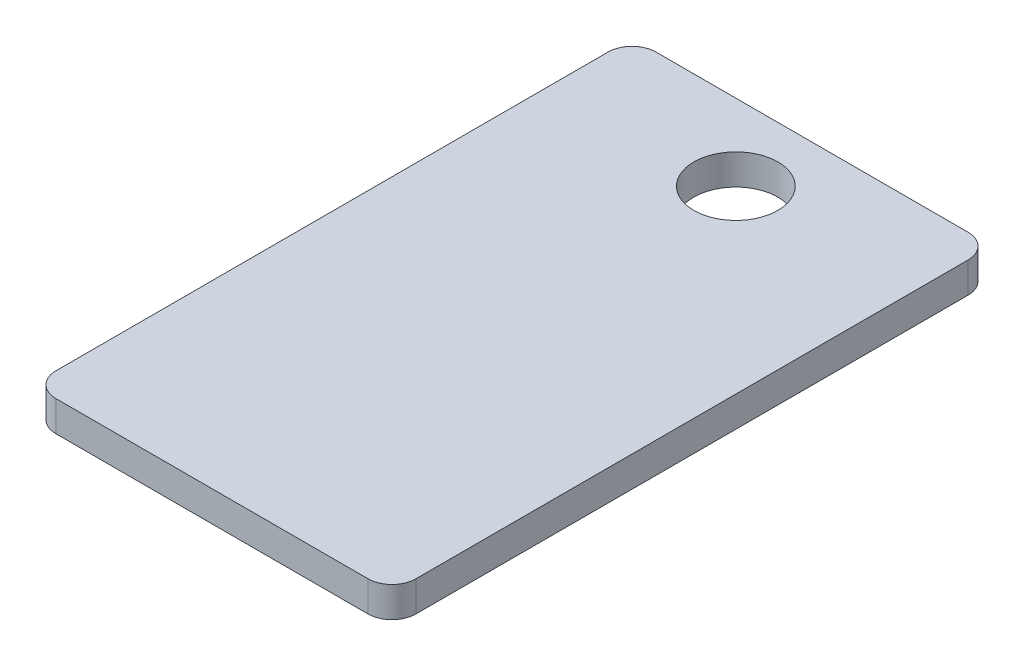
ISO-10303-21;
HEADER;
FILE_DESCRIPTION(('STEP AP214'),'2;1');
FILE_NAME('part.step','',(''),(''),'','','');
FILE_SCHEMA(('AUTOMOTIVE_DESIGN { 1 0 10303 214 1 1 1 1 }'));
ENDSEC;
DATA;
#1=APPLICATION_CONTEXT('core data for automotive mechanical design processes');
#2=APPLICATION_PROTOCOL_DEFINITION('international standard','automotive_design',2000,#1);
#3=PRODUCT_CONTEXT('',#1,'mechanical');
#4=PRODUCT('Part','Part','',(#3));
#5=PRODUCT_RELATED_PRODUCT_CATEGORY('part','',(#4));
#6=PRODUCT_DEFINITION_FORMATION('','',#4);
#7=PRODUCT_DEFINITION_CONTEXT('part definition',#1,'design');
#8=PRODUCT_DEFINITION('design','',#6,#7);
#9=PRODUCT_DEFINITION_SHAPE('','',#8);
#10=(LENGTH_UNIT() NAMED_UNIT(*) SI_UNIT(.MILLI.,.METRE.));
#11=(NAMED_UNIT(*) PLANE_ANGLE_UNIT() SI_UNIT($,.RADIAN.));
#12=(NAMED_UNIT(*) SI_UNIT($,.STERADIAN.) SOLID_ANGLE_UNIT());
#13=UNCERTAINTY_MEASURE_WITH_UNIT(LENGTH_MEASURE(1.E-05),#10,'distance_accuracy_value','');
#14=(GEOMETRIC_REPRESENTATION_CONTEXT(3) GLOBAL_UNCERTAINTY_ASSIGNED_CONTEXT((#13)) GLOBAL_UNIT_ASSIGNED_CONTEXT((#10,
#11,#12)) REPRESENTATION_CONTEXT('',''));
#15=CARTESIAN_POINT('',(0.,0.,0.));
#16=DIRECTION('',(0.,0.,1.));
#17=DIRECTION('',(1.,0.,0.));
#18=AXIS2_PLACEMENT_3D('',#15,#16,#17);
#19=CARTESIAN_POINT('',(0.,1.27,0.));
#20=DIRECTION('',(0.,1.,0.));
#21=DIRECTION('',(0.,0.,1.));
#22=AXIS2_PLACEMENT_3D('',#19,#20,#21);
#23=PLANE('',#22);
#24=DIRECTION('',(0.,0.,1.));
#25=VECTOR('',#24,1.);
#26=CARTESIAN_POINT('',(0.,1.27,0.));
#27=LINE('',#26,#25);
#28=CARTESIAN_POINT('',(0.,1.27,1.));
#29=VERTEX_POINT('',#28);
#30=CARTESIAN_POINT('',(0.,1.27,24.));
#31=VERTEX_POINT('',#30);
#32=EDGE_CURVE('E154',#29,#31,#27,.T.);
#33=ORIENTED_EDGE('',*,*,#32,.T.);
#34=CARTESIAN_POINT('',(1.,1.27,24.));
#35=DIRECTION('',(0.,1.,0.));
#36=DIRECTION('',(0.,0.,1.));
#37=AXIS2_PLACEMENT_3D('',#34,#35,#36);
#38=CIRCLE('',#37,1.);
#39=CARTESIAN_POINT('',(1.,1.27,25.));
#40=VERTEX_POINT('',#39);
#41=EDGE_CURVE('E178',#31,#40,#38,.T.);
#42=ORIENTED_EDGE('',*,*,#41,.T.);
#43=DIRECTION('',(1.,0.,0.));
#44=VECTOR('',#43,1.);
#45=CARTESIAN_POINT('',(0.,1.27,25.));
#46=LINE('',#45,#44);
#47=CARTESIAN_POINT('',(14.,1.27,25.));
#48=VERTEX_POINT('',#47);
#49=EDGE_CURVE('E131',#40,#48,#46,.T.);
#50=ORIENTED_EDGE('',*,*,#49,.T.);
#51=CARTESIAN_POINT('',(14.,1.27,24.));
#52=DIRECTION('',(0.,1.,0.));
#53=DIRECTION('',(0.,0.,1.));
#54=AXIS2_PLACEMENT_3D('',#51,#52,#53);
#55=CIRCLE('',#54,1.);
#56=CARTESIAN_POINT('',(15.,1.27,24.));
#57=VERTEX_POINT('',#56);
#58=EDGE_CURVE('E175',#48,#57,#55,.T.);
#59=ORIENTED_EDGE('',*,*,#58,.T.);
#60=DIRECTION('',(0.,0.,-1.));
#61=VECTOR('',#60,1.);
#62=CARTESIAN_POINT('',(15.,1.27,0.));
#63=LINE('',#62,#61);
#64=CARTESIAN_POINT('',(15.,1.27,1.));
#65=VERTEX_POINT('',#64);
#66=EDGE_CURVE('E190',#57,#65,#63,.T.);
#67=ORIENTED_EDGE('',*,*,#66,.T.);
#68=CARTESIAN_POINT('',(14.,1.27,1.));
#69=DIRECTION('',(0.,1.,0.));
#70=DIRECTION('',(0.,0.,1.));
#71=AXIS2_PLACEMENT_3D('',#68,#69,#70);
#72=CIRCLE('',#71,1.);
#73=CARTESIAN_POINT('',(14.,1.27,0.));
#74=VERTEX_POINT('',#73);
#75=EDGE_CURVE('E65',#65,#74,#72,.T.);
#76=ORIENTED_EDGE('',*,*,#75,.T.);
#77=DIRECTION('',(-1.,0.,0.));
#78=VECTOR('',#77,1.);
#79=CARTESIAN_POINT('',(0.,1.27,0.));
#80=LINE('',#79,#78);
#81=CARTESIAN_POINT('',(1.,1.27,0.));
#82=VERTEX_POINT('',#81);
#83=EDGE_CURVE('E156',#74,#82,#80,.T.);
#84=ORIENTED_EDGE('',*,*,#83,.T.);
#85=CARTESIAN_POINT('',(1.,1.27,1.));
#86=DIRECTION('',(0.,1.,0.));
#87=DIRECTION('',(0.,0.,1.));
#88=AXIS2_PLACEMENT_3D('',#85,#86,#87);
#89=CIRCLE('',#88,1.);
#90=EDGE_CURVE('E170',#82,#29,#89,.T.);
#91=ORIENTED_EDGE('',*,*,#90,.T.);
#92=EDGE_LOOP('',(#33,#42,#50,#59,#67,#76,#84,#91));
#93=FACE_BOUND('',#92,.T.);
#94=CARTESIAN_POINT('',(7.5,1.27,3.175));
#95=DIRECTION('',(0.,1.,0.));
#96=DIRECTION('',(0.,0.,1.));
#97=AXIS2_PLACEMENT_3D('',#94,#95,#96);
#98=CIRCLE('',#97,1.75);
#99=CARTESIAN_POINT('',(7.5,1.27,4.925));
#100=VERTEX_POINT('',#99);
#101=EDGE_CURVE('E148',#100,#100,#98,.T.);
#102=ORIENTED_EDGE('',*,*,#101,.F.);
#103=EDGE_LOOP('',(#102));
#104=FACE_BOUND('',#103,.T.);
#105=ADVANCED_FACE('F43',(#93,#104),#23,.T.);
#106=CARTESIAN_POINT('',(0.,0.,0.));
#107=DIRECTION('',(0.,1.,0.));
#108=DIRECTION('',(0.,0.,1.));
#109=AXIS2_PLACEMENT_3D('',#106,#107,#108);
#110=PLANE('',#109);
#111=DIRECTION('',(1.,0.,0.));
#112=VECTOR('',#111,1.);
#113=CARTESIAN_POINT('',(0.,0.,25.));
#114=LINE('',#113,#112);
#115=CARTESIAN_POINT('',(1.,0.,25.));
#116=VERTEX_POINT('',#115);
#117=CARTESIAN_POINT('',(14.,0.,25.));
#118=VERTEX_POINT('',#117);
#119=EDGE_CURVE('E128',#116,#118,#114,.T.);
#120=ORIENTED_EDGE('',*,*,#119,.F.);
#121=CARTESIAN_POINT('',(1.,0.,24.));
#122=DIRECTION('',(0.,1.,0.));
#123=DIRECTION('',(0.,0.,1.));
#124=AXIS2_PLACEMENT_3D('',#121,#122,#123);
#125=CIRCLE('',#124,1.);
#126=CARTESIAN_POINT('',(0.,0.,24.));
#127=VERTEX_POINT('',#126);
#128=EDGE_CURVE('E110',#116,#127,#125,.F.);
#129=ORIENTED_EDGE('',*,*,#128,.T.);
#130=DIRECTION('',(0.,0.,1.));
#131=VECTOR('',#130,1.);
#132=CARTESIAN_POINT('',(0.,0.,0.));
#133=LINE('',#132,#131);
#134=CARTESIAN_POINT('',(0.,0.,1.));
#135=VERTEX_POINT('',#134);
#136=EDGE_CURVE('E141',#135,#127,#133,.T.);
#137=ORIENTED_EDGE('',*,*,#136,.F.);
#138=CARTESIAN_POINT('',(1.,0.,1.));
#139=DIRECTION('',(0.,1.,0.));
#140=DIRECTION('',(0.,0.,1.));
#141=AXIS2_PLACEMENT_3D('',#138,#139,#140);
#142=CIRCLE('',#141,1.);
#143=CARTESIAN_POINT('',(1.,0.,0.));
#144=VERTEX_POINT('',#143);
#145=EDGE_CURVE('E133',#135,#144,#142,.F.);
#146=ORIENTED_EDGE('',*,*,#145,.T.);
#147=DIRECTION('',(-1.,0.,0.));
#148=VECTOR('',#147,1.);
#149=CARTESIAN_POINT('',(0.,0.,0.));
#150=LINE('',#149,#148);
#151=CARTESIAN_POINT('',(14.,0.,0.));
#152=VERTEX_POINT('',#151);
#153=EDGE_CURVE('E146',#152,#144,#150,.T.);
#154=ORIENTED_EDGE('',*,*,#153,.F.);
#155=CARTESIAN_POINT('',(14.,0.,1.));
#156=DIRECTION('',(0.,1.,0.));
#157=DIRECTION('',(0.,0.,1.));
#158=AXIS2_PLACEMENT_3D('',#155,#156,#157);
#159=CIRCLE('',#158,1.);
#160=CARTESIAN_POINT('',(15.,0.,1.));
#161=VERTEX_POINT('',#160);
#162=EDGE_CURVE('E160',#152,#161,#159,.F.);
#163=ORIENTED_EDGE('',*,*,#162,.T.);
#164=DIRECTION('',(0.,0.,-1.));
#165=VECTOR('',#164,1.);
#166=CARTESIAN_POINT('',(15.,0.,0.));
#167=LINE('',#166,#165);
#168=CARTESIAN_POINT('',(15.,0.,24.));
#169=VERTEX_POINT('',#168);
#170=EDGE_CURVE('E140',#169,#161,#167,.T.);
#171=ORIENTED_EDGE('',*,*,#170,.F.);
#172=CARTESIAN_POINT('',(14.,0.,24.));
#173=DIRECTION('',(0.,1.,0.));
#174=DIRECTION('',(0.,0.,1.));
#175=AXIS2_PLACEMENT_3D('',#172,#173,#174);
#176=CIRCLE('',#175,1.);
#177=EDGE_CURVE('E122',#169,#118,#176,.F.);
#178=ORIENTED_EDGE('',*,*,#177,.T.);
#179=EDGE_LOOP('',(#120,#129,#137,#146,#154,#163,#171,#178));
#180=FACE_BOUND('',#179,.T.);
#181=CARTESIAN_POINT('',(7.5,0.,3.175));
#182=DIRECTION('',(0.,1.,0.));
#183=DIRECTION('',(0.,0.,1.));
#184=AXIS2_PLACEMENT_3D('',#181,#182,#183);
#185=CIRCLE('',#184,1.75);
#186=CARTESIAN_POINT('',(7.5,0.,4.925));
#187=VERTEX_POINT('',#186);
#188=EDGE_CURVE('E199',#187,#187,#185,.T.);
#189=ORIENTED_EDGE('',*,*,#188,.T.);
#190=EDGE_LOOP('',(#189));
#191=FACE_BOUND('',#190,.T.);
#192=ADVANCED_FACE('F136',(#180,#191),#110,.F.);
#193=CARTESIAN_POINT('',(0.,1.27,0.));
#194=DIRECTION('',(1.,0.,0.));
#195=DIRECTION('',(0.,0.,-1.));
#196=AXIS2_PLACEMENT_3D('',#193,#194,#195);
#197=PLANE('',#196);
#198=ORIENTED_EDGE('',*,*,#136,.T.);
#199=DIRECTION('',(0.,-1.,0.));
#200=VECTOR('',#199,1.);
#201=CARTESIAN_POINT('',(0.,1.27,24.));
#202=LINE('',#201,#200);
#203=EDGE_CURVE('E115',#127,#31,#202,.F.);
#204=ORIENTED_EDGE('',*,*,#203,.T.);
#205=ORIENTED_EDGE('',*,*,#32,.F.);
#206=DIRECTION('',(0.,-1.,0.));
#207=VECTOR('',#206,1.);
#208=CARTESIAN_POINT('',(0.,1.27,1.));
#209=LINE('',#208,#207);
#210=EDGE_CURVE('E121',#29,#135,#209,.T.);
#211=ORIENTED_EDGE('',*,*,#210,.T.);
#212=EDGE_LOOP('',(#198,#204,#205,#211));
#213=FACE_BOUND('',#212,.T.);
#214=ADVANCED_FACE('F215',(#213),#197,.F.);
#215=CARTESIAN_POINT('',(0.,1.27,25.));
#216=DIRECTION('',(0.,0.,-1.));
#217=DIRECTION('',(-1.,0.,0.));
#218=AXIS2_PLACEMENT_3D('',#215,#216,#217);
#219=PLANE('',#218);
#220=ORIENTED_EDGE('',*,*,#49,.F.);
#221=DIRECTION('',(0.,-1.,0.));
#222=VECTOR('',#221,1.);
#223=CARTESIAN_POINT('',(1.,1.27,25.));
#224=LINE('',#223,#222);
#225=EDGE_CURVE('E114',#40,#116,#224,.T.);
#226=ORIENTED_EDGE('',*,*,#225,.T.);
#227=ORIENTED_EDGE('',*,*,#119,.T.);
#228=DIRECTION('',(0.,-1.,0.));
#229=VECTOR('',#228,1.);
#230=CARTESIAN_POINT('',(14.,1.27,25.));
#231=LINE('',#230,#229);
#232=EDGE_CURVE('E134',#118,#48,#231,.F.);
#233=ORIENTED_EDGE('',*,*,#232,.T.);
#234=EDGE_LOOP('',(#220,#226,#227,#233));
#235=FACE_BOUND('',#234,.T.);
#236=ADVANCED_FACE('F127',(#235),#219,.F.);
#237=CARTESIAN_POINT('',(15.,1.27,0.));
#238=DIRECTION('',(-1.,0.,0.));
#239=DIRECTION('',(0.,0.,1.));
#240=AXIS2_PLACEMENT_3D('',#237,#238,#239);
#241=PLANE('',#240);
#242=ORIENTED_EDGE('',*,*,#66,.F.);
#243=DIRECTION('',(0.,-1.,0.));
#244=VECTOR('',#243,1.);
#245=CARTESIAN_POINT('',(15.,1.27,24.));
#246=LINE('',#245,#244);
#247=EDGE_CURVE('E184',#57,#169,#246,.T.);
#248=ORIENTED_EDGE('',*,*,#247,.T.);
#249=ORIENTED_EDGE('',*,*,#170,.T.);
#250=DIRECTION('',(0.,-1.,0.));
#251=VECTOR('',#250,1.);
#252=CARTESIAN_POINT('',(15.,1.27,1.));
#253=LINE('',#252,#251);
#254=EDGE_CURVE('E181',#161,#65,#253,.F.);
#255=ORIENTED_EDGE('',*,*,#254,.T.);
#256=EDGE_LOOP('',(#242,#248,#249,#255));
#257=FACE_BOUND('',#256,.T.);
#258=ADVANCED_FACE('F222',(#257),#241,.F.);
#259=CARTESIAN_POINT('',(0.,1.27,0.));
#260=DIRECTION('',(0.,0.,1.));
#261=DIRECTION('',(1.,0.,0.));
#262=AXIS2_PLACEMENT_3D('',#259,#260,#261);
#263=PLANE('',#262);
#264=ORIENTED_EDGE('',*,*,#83,.F.);
#265=DIRECTION('',(0.,-1.,0.));
#266=VECTOR('',#265,1.);
#267=CARTESIAN_POINT('',(14.,1.27,0.));
#268=LINE('',#267,#266);
#269=EDGE_CURVE('E11',#74,#152,#268,.T.);
#270=ORIENTED_EDGE('',*,*,#269,.T.);
#271=ORIENTED_EDGE('',*,*,#153,.T.);
#272=DIRECTION('',(0.,-1.,0.));
#273=VECTOR('',#272,1.);
#274=CARTESIAN_POINT('',(1.,1.27,0.));
#275=LINE('',#274,#273);
#276=EDGE_CURVE('E52',#144,#82,#275,.F.);
#277=ORIENTED_EDGE('',*,*,#276,.T.);
#278=EDGE_LOOP('',(#264,#270,#271,#277));
#279=FACE_BOUND('',#278,.T.);
#280=ADVANCED_FACE('F219',(#279),#263,.F.);
#281=CARTESIAN_POINT('',(7.5,1.27,3.175));
#282=DIRECTION('',(0.,-1.,0.));
#283=DIRECTION('',(0.,0.,-1.));
#284=AXIS2_PLACEMENT_3D('',#281,#282,#283);
#285=CYLINDRICAL_SURFACE('',#284,1.75);
#286=ORIENTED_EDGE('',*,*,#101,.T.);
#287=EDGE_LOOP('',(#286));
#288=FACE_BOUND('',#287,.T.);
#289=ORIENTED_EDGE('',*,*,#188,.F.);
#290=EDGE_LOOP('',(#289));
#291=FACE_BOUND('',#290,.T.);
#292=ADVANCED_FACE('F207',(#288,#291),#285,.F.);
#293=CARTESIAN_POINT('',(1.,1.27,24.));
#294=DIRECTION('',(0.,-1.,0.));
#295=DIRECTION('',(0.,0.,-1.));
#296=AXIS2_PLACEMENT_3D('',#293,#294,#295);
#297=CYLINDRICAL_SURFACE('',#296,1.);
#298=ORIENTED_EDGE('',*,*,#41,.F.);
#299=ORIENTED_EDGE('',*,*,#203,.F.);
#300=ORIENTED_EDGE('',*,*,#128,.F.);
#301=ORIENTED_EDGE('',*,*,#225,.F.);
#302=EDGE_LOOP('',(#298,#299,#300,#301));
#303=FACE_BOUND('',#302,.T.);
#304=ADVANCED_FACE('F113',(#303),#297,.T.);
#305=CARTESIAN_POINT('',(14.,1.27,24.));
#306=DIRECTION('',(0.,-1.,0.));
#307=DIRECTION('',(0.,0.,-1.));
#308=AXIS2_PLACEMENT_3D('',#305,#306,#307);
#309=CYLINDRICAL_SURFACE('',#308,1.);
#310=ORIENTED_EDGE('',*,*,#58,.F.);
#311=ORIENTED_EDGE('',*,*,#232,.F.);
#312=ORIENTED_EDGE('',*,*,#177,.F.);
#313=ORIENTED_EDGE('',*,*,#247,.F.);
#314=EDGE_LOOP('',(#310,#311,#312,#313));
#315=FACE_BOUND('',#314,.T.);
#316=ADVANCED_FACE('F233',(#315),#309,.T.);
#317=CARTESIAN_POINT('',(14.,1.27,1.));
#318=DIRECTION('',(0.,-1.,0.));
#319=DIRECTION('',(0.,0.,-1.));
#320=AXIS2_PLACEMENT_3D('',#317,#318,#319);
#321=CYLINDRICAL_SURFACE('',#320,1.);
#322=ORIENTED_EDGE('',*,*,#75,.F.);
#323=ORIENTED_EDGE('',*,*,#254,.F.);
#324=ORIENTED_EDGE('',*,*,#162,.F.);
#325=ORIENTED_EDGE('',*,*,#269,.F.);
#326=EDGE_LOOP('',(#322,#323,#324,#325));
#327=FACE_BOUND('',#326,.T.);
#328=ADVANCED_FACE('F235',(#327),#321,.T.);
#329=CARTESIAN_POINT('',(1.,1.27,1.));
#330=DIRECTION('',(0.,-1.,0.));
#331=DIRECTION('',(0.,0.,-1.));
#332=AXIS2_PLACEMENT_3D('',#329,#330,#331);
#333=CYLINDRICAL_SURFACE('',#332,1.);
#334=ORIENTED_EDGE('',*,*,#90,.F.);
#335=ORIENTED_EDGE('',*,*,#276,.F.);
#336=ORIENTED_EDGE('',*,*,#145,.F.);
#337=ORIENTED_EDGE('',*,*,#210,.F.);
#338=EDGE_LOOP('',(#334,#335,#336,#337));
#339=FACE_BOUND('',#338,.T.);
#340=ADVANCED_FACE('F45',(#339),#333,.T.);
#341=CLOSED_SHELL('',(#105,#192,#214,#236,#258,#280,#292,#304,#316,#328,#340));
#342=MANIFOLD_SOLID_BREP('B2',#341);
#343=ADVANCED_BREP_SHAPE_REPRESENTATION('',(#18,#342),#14);
#344=SHAPE_DEFINITION_REPRESENTATION(#9,#343);
ENDSEC;
END-ISO-10303-21;
